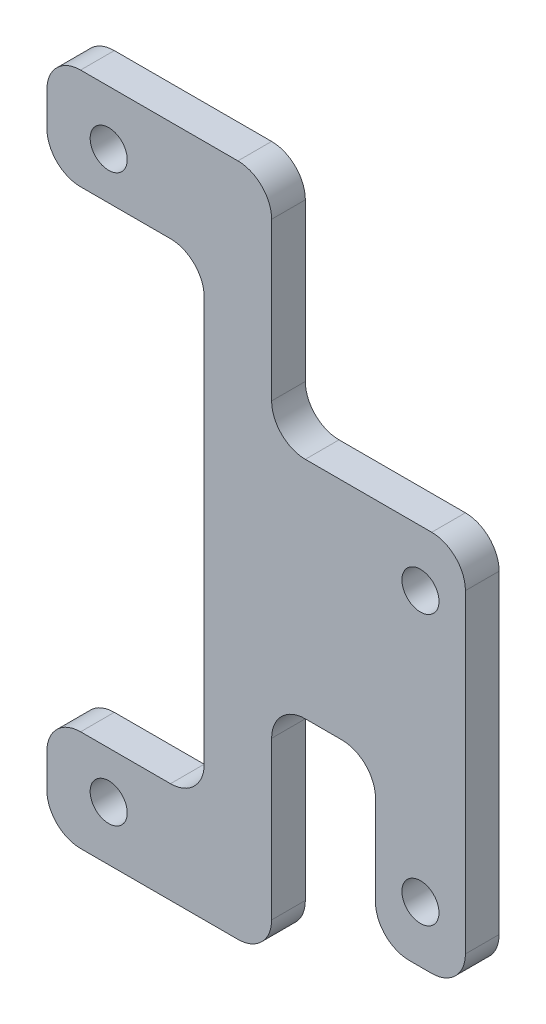
ISO-10303-21;
HEADER;
FILE_DESCRIPTION(('STEP AP214'),'2;1');
FILE_NAME('part.step','',(''),(''),'','','');
FILE_SCHEMA(('AUTOMOTIVE_DESIGN { 1 0 10303 214 1 1 1 1 }'));
ENDSEC;
DATA;
#1=APPLICATION_CONTEXT('core data for automotive mechanical design processes');
#2=APPLICATION_PROTOCOL_DEFINITION('international standard','automotive_design',2000,#1);
#3=PRODUCT_CONTEXT('',#1,'mechanical');
#4=PRODUCT('Part','Part','',(#3));
#5=PRODUCT_RELATED_PRODUCT_CATEGORY('part','',(#4));
#6=PRODUCT_DEFINITION_FORMATION('','',#4);
#7=PRODUCT_DEFINITION_CONTEXT('part definition',#1,'design');
#8=PRODUCT_DEFINITION('design','',#6,#7);
#9=PRODUCT_DEFINITION_SHAPE('','',#8);
#10=(LENGTH_UNIT() NAMED_UNIT(*) SI_UNIT(.MILLI.,.METRE.));
#11=(NAMED_UNIT(*) PLANE_ANGLE_UNIT() SI_UNIT($,.RADIAN.));
#12=(NAMED_UNIT(*) SI_UNIT($,.STERADIAN.) SOLID_ANGLE_UNIT());
#13=UNCERTAINTY_MEASURE_WITH_UNIT(LENGTH_MEASURE(1.E-05),#10,'distance_accuracy_value','');
#14=(GEOMETRIC_REPRESENTATION_CONTEXT(3) GLOBAL_UNCERTAINTY_ASSIGNED_CONTEXT((#13)) GLOBAL_UNIT_ASSIGNED_CONTEXT((#10,
#11,#12)) REPRESENTATION_CONTEXT('',''));
#15=CARTESIAN_POINT('',(0.,0.,0.));
#16=DIRECTION('',(0.,0.,1.));
#17=DIRECTION('',(1.,0.,0.));
#18=AXIS2_PLACEMENT_3D('',#15,#16,#17);
#19=CARTESIAN_POINT('',(-33.245,0.,0.));
#20=DIRECTION('',(-1.,0.,0.));
#21=DIRECTION('',(0.,-1.,0.));
#22=AXIS2_PLACEMENT_3D('',#19,#20,#21);
#23=PLANE('',#22);
#24=DIRECTION('',(0.,-1.,0.));
#25=VECTOR('',#24,1.);
#26=CARTESIAN_POINT('',(-33.245,37.,0.));
#27=LINE('',#26,#25);
#28=CARTESIAN_POINT('',(-33.245,34.,0.));
#29=VERTEX_POINT('',#28);
#30=CARTESIAN_POINT('',(-33.245,31.,0.));
#31=VERTEX_POINT('',#30);
#32=EDGE_CURVE('E504',#29,#31,#27,.T.);
#33=ORIENTED_EDGE('',*,*,#32,.T.);
#34=DIRECTION('',(0.,0.,-1.));
#35=VECTOR('',#34,1.);
#36=CARTESIAN_POINT('',(-33.245,31.,3.));
#37=LINE('',#36,#35);
#38=CARTESIAN_POINT('',(-33.245,31.,3.));
#39=VERTEX_POINT('',#38);
#40=EDGE_CURVE('E66',#31,#39,#37,.F.);
#41=ORIENTED_EDGE('',*,*,#40,.T.);
#42=DIRECTION('',(0.,1.,0.));
#43=VECTOR('',#42,1.);
#44=CARTESIAN_POINT('',(-33.245,37.,3.));
#45=LINE('',#44,#43);
#46=CARTESIAN_POINT('',(-33.245,34.,3.));
#47=VERTEX_POINT('',#46);
#48=EDGE_CURVE('E496',#39,#47,#45,.T.);
#49=ORIENTED_EDGE('',*,*,#48,.T.);
#50=DIRECTION('',(0.,0.,-1.));
#51=VECTOR('',#50,1.);
#52=CARTESIAN_POINT('',(-33.245,34.,0.));
#53=LINE('',#52,#51);
#54=EDGE_CURVE('E427',#47,#29,#53,.T.);
#55=ORIENTED_EDGE('',*,*,#54,.T.);
#56=EDGE_LOOP('',(#33,#41,#49,#55));
#57=FACE_BOUND('',#56,.T.);
#58=ADVANCED_FACE('F43',(#57),#23,.T.);
#59=CARTESIAN_POINT('',(-4.,17.,3.));
#60=DIRECTION('',(1.,0.,0.));
#61=DIRECTION('',(0.,1.,0.));
#62=AXIS2_PLACEMENT_3D('',#59,#60,#61);
#63=PLANE('',#62);
#64=DIRECTION('',(0.,-1.,0.));
#65=VECTOR('',#64,1.);
#66=CARTESIAN_POINT('',(-4.,17.,0.));
#67=LINE('',#66,#65);
#68=CARTESIAN_POINT('',(-4.,-6.,0.));
#69=VERTEX_POINT('',#68);
#70=CARTESIAN_POINT('',(-4.,-14.,0.));
#71=VERTEX_POINT('',#70);
#72=EDGE_CURVE('E267',#69,#71,#67,.T.);
#73=ORIENTED_EDGE('',*,*,#72,.T.);
#74=DIRECTION('',(0.,0.,-1.));
#75=VECTOR('',#74,1.);
#76=CARTESIAN_POINT('',(-4.,-14.,3.));
#77=LINE('',#76,#75);
#78=CARTESIAN_POINT('',(-4.,-14.,3.));
#79=VERTEX_POINT('',#78);
#80=EDGE_CURVE('E353',#71,#79,#77,.F.);
#81=ORIENTED_EDGE('',*,*,#80,.T.);
#82=DIRECTION('',(0.,-1.,0.));
#83=VECTOR('',#82,1.);
#84=CARTESIAN_POINT('',(-4.,17.,3.));
#85=LINE('',#84,#83);
#86=CARTESIAN_POINT('',(-4.,-6.,3.));
#87=VERTEX_POINT('',#86);
#88=EDGE_CURVE('E550',#87,#79,#85,.T.);
#89=ORIENTED_EDGE('',*,*,#88,.F.);
#90=DIRECTION('',(0.,0.,1.));
#91=VECTOR('',#90,1.);
#92=CARTESIAN_POINT('',(-4.,-6.,0.));
#93=LINE('',#92,#91);
#94=EDGE_CURVE('E350',#87,#69,#93,.F.);
#95=ORIENTED_EDGE('',*,*,#94,.T.);
#96=EDGE_LOOP('',(#73,#81,#89,#95));
#97=FACE_BOUND('',#96,.T.);
#98=ADVANCED_FACE('F566',(#97),#63,.F.);
#99=CARTESIAN_POINT('',(0.,0.,3.));
#100=DIRECTION('',(0.,0.,1.));
#101=DIRECTION('',(1.,0.,0.));
#102=AXIS2_PLACEMENT_3D('',#99,#100,#101);
#103=PLANE('',#102);
#104=CARTESIAN_POINT('',(-27.745,32.17,3.));
#105=DIRECTION('',(0.,0.,1.));
#106=DIRECTION('',(1.,0.,0.));
#107=AXIS2_PLACEMENT_3D('',#104,#105,#106);
#108=CIRCLE('',#107,1.65);
#109=CARTESIAN_POINT('',(-26.095,32.17,3.));
#110=VERTEX_POINT('',#109);
#111=EDGE_CURVE('E291',#110,#110,#108,.T.);
#112=ORIENTED_EDGE('',*,*,#111,.F.);
#113=EDGE_LOOP('',(#112));
#114=FACE_BOUND('',#113,.T.);
#115=CARTESIAN_POINT('',(-27.745,-18.17,3.));
#116=DIRECTION('',(0.,0.,1.));
#117=DIRECTION('',(-1.,0.,0.));
#118=AXIS2_PLACEMENT_3D('',#115,#116,#117);
#119=CIRCLE('',#118,1.65);
#120=CARTESIAN_POINT('',(-29.395,-18.17,3.));
#121=VERTEX_POINT('',#120);
#122=EDGE_CURVE('E621',#121,#121,#119,.T.);
#123=ORIENTED_EDGE('',*,*,#122,.F.);
#124=EDGE_LOOP('',(#123));
#125=FACE_BOUND('',#124,.T.);
#126=DIRECTION('',(1.,0.,0.));
#127=VECTOR('',#126,1.);
#128=CARTESIAN_POINT('',(-4.,-17.,3.));
#129=LINE('',#128,#127);
#130=CARTESIAN_POINT('',(-0.999999999999999,-17.,3.));
#131=VERTEX_POINT('',#130);
#132=CARTESIAN_POINT('',(1.,-17.,3.));
#133=VERTEX_POINT('',#132);
#134=EDGE_CURVE('E273',#131,#133,#129,.T.);
#135=ORIENTED_EDGE('',*,*,#134,.T.);
#136=CARTESIAN_POINT('',(1.,-14.,3.));
#137=DIRECTION('',(0.,0.,1.));
#138=DIRECTION('',(1.,0.,0.));
#139=AXIS2_PLACEMENT_3D('',#136,#137,#138);
#140=CIRCLE('',#139,3.);
#141=CARTESIAN_POINT('',(4.,-14.,3.));
#142=VERTEX_POINT('',#141);
#143=EDGE_CURVE('E347',#133,#142,#140,.T.);
#144=ORIENTED_EDGE('',*,*,#143,.T.);
#145=DIRECTION('',(0.,1.,0.));
#146=VECTOR('',#145,1.);
#147=CARTESIAN_POINT('',(4.,17.,3.));
#148=LINE('',#147,#146);
#149=CARTESIAN_POINT('',(4.,14.,3.));
#150=VERTEX_POINT('',#149);
#151=EDGE_CURVE('E251',#142,#150,#148,.T.);
#152=ORIENTED_EDGE('',*,*,#151,.T.);
#153=CARTESIAN_POINT('',(0.999999999999997,14.,3.));
#154=DIRECTION('',(0.,0.,1.));
#155=DIRECTION('',(1.,0.,0.));
#156=AXIS2_PLACEMENT_3D('',#153,#154,#155);
#157=CIRCLE('',#156,3.);
#158=CARTESIAN_POINT('',(0.999999999999997,17.,3.));
#159=VERTEX_POINT('',#158);
#160=EDGE_CURVE('E332',#150,#159,#157,.T.);
#161=ORIENTED_EDGE('',*,*,#160,.T.);
#162=DIRECTION('',(-1.,0.,0.));
#163=VECTOR('',#162,1.);
#164=CARTESIAN_POINT('',(-4.,17.,3.));
#165=LINE('',#164,#163);
#166=CARTESIAN_POINT('',(-10.245,17.,3.));
#167=VERTEX_POINT('',#166);
#168=EDGE_CURVE('E547',#159,#167,#165,.T.);
#169=ORIENTED_EDGE('',*,*,#168,.T.);
#170=CARTESIAN_POINT('',(-10.245,20.,3.));
#171=DIRECTION('',(0.,0.,1.));
#172=DIRECTION('',(1.,0.,0.));
#173=AXIS2_PLACEMENT_3D('',#170,#171,#172);
#174=CIRCLE('',#173,3.);
#175=CARTESIAN_POINT('',(-13.245,20.,3.));
#176=VERTEX_POINT('',#175);
#177=EDGE_CURVE('E454',#167,#176,#174,.F.);
#178=ORIENTED_EDGE('',*,*,#177,.T.);
#179=DIRECTION('',(0.,1.,0.));
#180=VECTOR('',#179,1.);
#181=CARTESIAN_POINT('',(-13.245,37.,3.));
#182=LINE('',#181,#180);
#183=CARTESIAN_POINT('',(-13.245,34.,3.));
#184=VERTEX_POINT('',#183);
#185=EDGE_CURVE('E484',#176,#184,#182,.T.);
#186=ORIENTED_EDGE('',*,*,#185,.T.);
#187=CARTESIAN_POINT('',(-16.245,34.,3.));
#188=DIRECTION('',(0.,0.,1.));
#189=DIRECTION('',(1.,0.,0.));
#190=AXIS2_PLACEMENT_3D('',#187,#188,#189);
#191=CIRCLE('',#190,3.);
#192=CARTESIAN_POINT('',(-16.245,37.,3.));
#193=VERTEX_POINT('',#192);
#194=EDGE_CURVE('E329',#184,#193,#191,.T.);
#195=ORIENTED_EDGE('',*,*,#194,.T.);
#196=DIRECTION('',(1.,0.,0.));
#197=VECTOR('',#196,1.);
#198=CARTESIAN_POINT('',(-33.245,37.,3.));
#199=LINE('',#198,#197);
#200=CARTESIAN_POINT('',(-30.245,37.,3.));
#201=VERTEX_POINT('',#200);
#202=EDGE_CURVE('E522',#201,#193,#199,.T.);
#203=ORIENTED_EDGE('',*,*,#202,.F.);
#204=CARTESIAN_POINT('',(-30.245,34.,3.));
#205=DIRECTION('',(0.,0.,1.));
#206=DIRECTION('',(1.,0.,0.));
#207=AXIS2_PLACEMENT_3D('',#204,#205,#206);
#208=CIRCLE('',#207,3.);
#209=EDGE_CURVE('E59',#201,#47,#208,.T.);
#210=ORIENTED_EDGE('',*,*,#209,.T.);
#211=ORIENTED_EDGE('',*,*,#48,.F.);
#212=CARTESIAN_POINT('',(-30.245,31.,3.));
#213=DIRECTION('',(0.,0.,1.));
#214=DIRECTION('',(1.,0.,0.));
#215=AXIS2_PLACEMENT_3D('',#212,#213,#214);
#216=CIRCLE('',#215,3.);
#217=CARTESIAN_POINT('',(-30.245,28.,3.));
#218=VERTEX_POINT('',#217);
#219=EDGE_CURVE('E326',#39,#218,#216,.T.);
#220=ORIENTED_EDGE('',*,*,#219,.T.);
#221=DIRECTION('',(-1.,0.,0.));
#222=VECTOR('',#221,1.);
#223=CARTESIAN_POINT('',(-33.245,28.,3.));
#224=LINE('',#223,#222);
#225=CARTESIAN_POINT('',(-22.245,28.,3.));
#226=VERTEX_POINT('',#225);
#227=EDGE_CURVE('E465',#226,#218,#224,.T.);
#228=ORIENTED_EDGE('',*,*,#227,.F.);
#229=CARTESIAN_POINT('',(-22.245,25.,3.));
#230=DIRECTION('',(0.,0.,1.));
#231=DIRECTION('',(1.,0.,0.));
#232=AXIS2_PLACEMENT_3D('',#229,#230,#231);
#233=CIRCLE('',#232,3.);
#234=CARTESIAN_POINT('',(-19.245,25.,3.));
#235=VERTEX_POINT('',#234);
#236=EDGE_CURVE('E52',#226,#235,#233,.F.);
#237=ORIENTED_EDGE('',*,*,#236,.T.);
#238=DIRECTION('',(0.,1.,0.));
#239=VECTOR('',#238,1.);
#240=CARTESIAN_POINT('',(-19.245,28.,3.));
#241=LINE('',#240,#239);
#242=CARTESIAN_POINT('',(-19.245,-11.,3.));
#243=VERTEX_POINT('',#242);
#244=EDGE_CURVE('E463',#243,#235,#241,.T.);
#245=ORIENTED_EDGE('',*,*,#244,.F.);
#246=CARTESIAN_POINT('',(-22.245,-11.,3.));
#247=DIRECTION('',(0.,0.,1.));
#248=DIRECTION('',(1.,0.,0.));
#249=AXIS2_PLACEMENT_3D('',#246,#247,#248);
#250=CIRCLE('',#249,3.);
#251=CARTESIAN_POINT('',(-22.245,-14.,3.));
#252=VERTEX_POINT('',#251);
#253=EDGE_CURVE('E445',#243,#252,#250,.F.);
#254=ORIENTED_EDGE('',*,*,#253,.T.);
#255=DIRECTION('',(1.,0.,0.));
#256=VECTOR('',#255,1.);
#257=CARTESIAN_POINT('',(-33.245,-14.,3.));
#258=LINE('',#257,#256);
#259=CARTESIAN_POINT('',(-30.245,-14.,3.));
#260=VERTEX_POINT('',#259);
#261=EDGE_CURVE('E295',#260,#252,#258,.T.);
#262=ORIENTED_EDGE('',*,*,#261,.F.);
#263=CARTESIAN_POINT('',(-30.245,-17.,3.));
#264=DIRECTION('',(0.,0.,1.));
#265=DIRECTION('',(1.,0.,0.));
#266=AXIS2_PLACEMENT_3D('',#263,#264,#265);
#267=CIRCLE('',#266,3.);
#268=CARTESIAN_POINT('',(-33.245,-17.,3.));
#269=VERTEX_POINT('',#268);
#270=EDGE_CURVE('E335',#260,#269,#267,.T.);
#271=ORIENTED_EDGE('',*,*,#270,.T.);
#272=CARTESIAN_POINT('',(-33.245,-20.,3.));
#273=VERTEX_POINT('',#272);
#274=EDGE_CURVE('E499',#273,#269,#45,.T.);
#275=ORIENTED_EDGE('',*,*,#274,.F.);
#276=CARTESIAN_POINT('',(-30.245,-20.,3.));
#277=DIRECTION('',(0.,0.,1.));
#278=DIRECTION('',(1.,0.,0.));
#279=AXIS2_PLACEMENT_3D('',#276,#277,#278);
#280=CIRCLE('',#279,3.);
#281=CARTESIAN_POINT('',(-30.245,-23.,3.));
#282=VERTEX_POINT('',#281);
#283=EDGE_CURVE('E338',#273,#282,#280,.T.);
#284=ORIENTED_EDGE('',*,*,#283,.T.);
#285=DIRECTION('',(1.,0.,0.));
#286=VECTOR('',#285,1.);
#287=CARTESIAN_POINT('',(-33.245,-23.,3.));
#288=LINE('',#287,#286);
#289=CARTESIAN_POINT('',(-16.245,-23.,3.));
#290=VERTEX_POINT('',#289);
#291=EDGE_CURVE('E510',#282,#290,#288,.T.);
#292=ORIENTED_EDGE('',*,*,#291,.T.);
#293=CARTESIAN_POINT('',(-16.245,-20.,3.));
#294=DIRECTION('',(0.,0.,1.));
#295=DIRECTION('',(1.,0.,0.));
#296=AXIS2_PLACEMENT_3D('',#293,#294,#295);
#297=CIRCLE('',#296,3.);
#298=CARTESIAN_POINT('',(-13.245,-20.,3.));
#299=VERTEX_POINT('',#298);
#300=EDGE_CURVE('E341',#290,#299,#297,.T.);
#301=ORIENTED_EDGE('',*,*,#300,.T.);
#302=CARTESIAN_POINT('',(-13.245,-6.,3.));
#303=VERTEX_POINT('',#302);
#304=EDGE_CURVE('E490',#299,#303,#182,.T.);
#305=ORIENTED_EDGE('',*,*,#304,.T.);
#306=CARTESIAN_POINT('',(-10.245,-6.,3.));
#307=DIRECTION('',(0.,0.,1.));
#308=DIRECTION('',(1.,0.,0.));
#309=AXIS2_PLACEMENT_3D('',#306,#307,#308);
#310=CIRCLE('',#309,3.);
#311=CARTESIAN_POINT('',(-10.245,-3.,3.));
#312=VERTEX_POINT('',#311);
#313=EDGE_CURVE('E439',#303,#312,#310,.F.);
#314=ORIENTED_EDGE('',*,*,#313,.T.);
#315=DIRECTION('',(1.,0.,0.));
#316=VECTOR('',#315,1.);
#317=CARTESIAN_POINT('',(-13.245,-3.,3.));
#318=LINE('',#317,#316);
#319=CARTESIAN_POINT('',(-7.,-3.,3.));
#320=VERTEX_POINT('',#319);
#321=EDGE_CURVE('E526',#312,#320,#318,.T.);
#322=ORIENTED_EDGE('',*,*,#321,.T.);
#323=CARTESIAN_POINT('',(-7.,-6.,3.));
#324=DIRECTION('',(0.,0.,1.));
#325=DIRECTION('',(1.,0.,0.));
#326=AXIS2_PLACEMENT_3D('',#323,#324,#325);
#327=CIRCLE('',#326,3.);
#328=EDGE_CURVE('E433',#320,#87,#327,.F.);
#329=ORIENTED_EDGE('',*,*,#328,.T.);
#330=ORIENTED_EDGE('',*,*,#88,.T.);
#331=CARTESIAN_POINT('',(-0.999999999999999,-14.,3.));
#332=DIRECTION('',(0.,0.,1.));
#333=DIRECTION('',(1.,0.,0.));
#334=AXIS2_PLACEMENT_3D('',#331,#332,#333);
#335=CIRCLE('',#334,3.);
#336=EDGE_CURVE('E344',#79,#131,#335,.T.);
#337=ORIENTED_EDGE('',*,*,#336,.T.);
#338=EDGE_LOOP('',(#135,#144,#152,#161,#169,#178,#186,#195,#203,#210,#211,#220,#228,#237,#245,
#254,#262,#271,#275,#284,#292,#301,#305,#314,#322,#329,#330,#337));
#339=FACE_BOUND('',#338,.T.);
#340=CARTESIAN_POINT('',(0.,12.,3.));
#341=DIRECTION('',(0.,0.,1.));
#342=DIRECTION('',(1.,0.,0.));
#343=AXIS2_PLACEMENT_3D('',#340,#341,#342);
#344=CIRCLE('',#343,1.65);
#345=CARTESIAN_POINT('',(1.65,12.,3.));
#346=VERTEX_POINT('',#345);
#347=EDGE_CURVE('E262',#346,#346,#344,.T.);
#348=ORIENTED_EDGE('',*,*,#347,.F.);
#349=EDGE_LOOP('',(#348));
#350=FACE_BOUND('',#349,.T.);
#351=CARTESIAN_POINT('',(0.,-12.,3.));
#352=DIRECTION('',(0.,0.,1.));
#353=DIRECTION('',(-1.,0.,0.));
#354=AXIS2_PLACEMENT_3D('',#351,#352,#353);
#355=CIRCLE('',#354,1.65);
#356=CARTESIAN_POINT('',(-1.65,-12.,3.));
#357=VERTEX_POINT('',#356);
#358=EDGE_CURVE('E535',#357,#357,#355,.T.);
#359=ORIENTED_EDGE('',*,*,#358,.F.);
#360=EDGE_LOOP('',(#359));
#361=FACE_BOUND('',#360,.T.);
#362=ADVANCED_FACE('F461',(#114,#125,#339,#350,#361),#103,.T.);
#363=CARTESIAN_POINT('',(0.,0.,0.));
#364=DIRECTION('',(0.,0.,1.));
#365=DIRECTION('',(1.,0.,0.));
#366=AXIS2_PLACEMENT_3D('',#363,#364,#365);
#367=PLANE('',#366);
#368=CARTESIAN_POINT('',(-27.745,32.17,0.));
#369=DIRECTION('',(0.,0.,1.));
#370=DIRECTION('',(1.,0.,0.));
#371=AXIS2_PLACEMENT_3D('',#368,#369,#370);
#372=CIRCLE('',#371,1.65);
#373=CARTESIAN_POINT('',(-26.095,32.17,0.));
#374=VERTEX_POINT('',#373);
#375=EDGE_CURVE('E290',#374,#374,#372,.T.);
#376=ORIENTED_EDGE('',*,*,#375,.T.);
#377=EDGE_LOOP('',(#376));
#378=FACE_BOUND('',#377,.T.);
#379=CARTESIAN_POINT('',(-27.745,-18.17,0.));
#380=DIRECTION('',(0.,0.,1.));
#381=DIRECTION('',(1.,0.,0.));
#382=AXIS2_PLACEMENT_3D('',#379,#380,#381);
#383=CIRCLE('',#382,1.65);
#384=CARTESIAN_POINT('',(-26.095,-18.17,0.));
#385=VERTEX_POINT('',#384);
#386=EDGE_CURVE('E286',#385,#385,#383,.T.);
#387=ORIENTED_EDGE('',*,*,#386,.T.);
#388=EDGE_LOOP('',(#387));
#389=FACE_BOUND('',#388,.T.);
#390=DIRECTION('',(0.,1.,0.));
#391=VECTOR('',#390,1.);
#392=CARTESIAN_POINT('',(4.,17.,0.));
#393=LINE('',#392,#391);
#394=CARTESIAN_POINT('',(4.,-14.,0.));
#395=VERTEX_POINT('',#394);
#396=CARTESIAN_POINT('',(4.,14.,0.));
#397=VERTEX_POINT('',#396);
#398=EDGE_CURVE('E248',#395,#397,#393,.T.);
#399=ORIENTED_EDGE('',*,*,#398,.F.);
#400=CARTESIAN_POINT('',(1.,-14.,0.));
#401=DIRECTION('',(0.,0.,1.));
#402=DIRECTION('',(1.,0.,0.));
#403=AXIS2_PLACEMENT_3D('',#400,#401,#402);
#404=CIRCLE('',#403,3.);
#405=CARTESIAN_POINT('',(1.,-17.,0.));
#406=VERTEX_POINT('',#405);
#407=EDGE_CURVE('E230',#395,#406,#404,.F.);
#408=ORIENTED_EDGE('',*,*,#407,.T.);
#409=DIRECTION('',(1.,0.,0.));
#410=VECTOR('',#409,1.);
#411=CARTESIAN_POINT('',(-4.,-17.,0.));
#412=LINE('',#411,#410);
#413=CARTESIAN_POINT('',(-0.999999999999999,-17.,0.));
#414=VERTEX_POINT('',#413);
#415=EDGE_CURVE('E279',#414,#406,#412,.T.);
#416=ORIENTED_EDGE('',*,*,#415,.F.);
#417=CARTESIAN_POINT('',(-0.999999999999999,-14.,0.));
#418=DIRECTION('',(0.,0.,1.));
#419=DIRECTION('',(1.,0.,0.));
#420=AXIS2_PLACEMENT_3D('',#417,#418,#419);
#421=CIRCLE('',#420,3.);
#422=EDGE_CURVE('E242',#414,#71,#421,.F.);
#423=ORIENTED_EDGE('',*,*,#422,.T.);
#424=ORIENTED_EDGE('',*,*,#72,.F.);
#425=CARTESIAN_POINT('',(-7.,-6.,0.));
#426=DIRECTION('',(0.,0.,1.));
#427=DIRECTION('',(1.,0.,0.));
#428=AXIS2_PLACEMENT_3D('',#425,#426,#427);
#429=CIRCLE('',#428,3.);
#430=CARTESIAN_POINT('',(-7.,-3.,0.));
#431=VERTEX_POINT('',#430);
#432=EDGE_CURVE('E436',#69,#431,#429,.T.);
#433=ORIENTED_EDGE('',*,*,#432,.T.);
#434=DIRECTION('',(1.,0.,0.));
#435=VECTOR('',#434,1.);
#436=CARTESIAN_POINT('',(-13.245,-3.,0.));
#437=LINE('',#436,#435);
#438=CARTESIAN_POINT('',(-10.245,-3.,0.));
#439=VERTEX_POINT('',#438);
#440=EDGE_CURVE('E530',#439,#431,#437,.T.);
#441=ORIENTED_EDGE('',*,*,#440,.F.);
#442=CARTESIAN_POINT('',(-10.245,-6.,0.));
#443=DIRECTION('',(0.,0.,1.));
#444=DIRECTION('',(1.,0.,0.));
#445=AXIS2_PLACEMENT_3D('',#442,#443,#444);
#446=CIRCLE('',#445,3.);
#447=CARTESIAN_POINT('',(-13.245,-6.,0.));
#448=VERTEX_POINT('',#447);
#449=EDGE_CURVE('E442',#439,#448,#446,.T.);
#450=ORIENTED_EDGE('',*,*,#449,.T.);
#451=DIRECTION('',(0.,-1.,0.));
#452=VECTOR('',#451,1.);
#453=CARTESIAN_POINT('',(-13.245,37.,0.));
#454=LINE('',#453,#452);
#455=CARTESIAN_POINT('',(-13.245,-20.,0.));
#456=VERTEX_POINT('',#455);
#457=EDGE_CURVE('E506',#448,#456,#454,.T.);
#458=ORIENTED_EDGE('',*,*,#457,.T.);
#459=CARTESIAN_POINT('',(-16.245,-20.,0.));
#460=DIRECTION('',(0.,0.,1.));
#461=DIRECTION('',(1.,0.,0.));
#462=AXIS2_PLACEMENT_3D('',#459,#460,#461);
#463=CIRCLE('',#462,3.);
#464=CARTESIAN_POINT('',(-16.245,-23.,0.));
#465=VERTEX_POINT('',#464);
#466=EDGE_CURVE('E314',#456,#465,#463,.F.);
#467=ORIENTED_EDGE('',*,*,#466,.T.);
#468=DIRECTION('',(1.,0.,0.));
#469=VECTOR('',#468,1.);
#470=CARTESIAN_POINT('',(-33.245,-23.,0.));
#471=LINE('',#470,#469);
#472=CARTESIAN_POINT('',(-30.245,-23.,0.));
#473=VERTEX_POINT('',#472);
#474=EDGE_CURVE('E514',#473,#465,#471,.T.);
#475=ORIENTED_EDGE('',*,*,#474,.F.);
#476=CARTESIAN_POINT('',(-30.245,-20.,0.));
#477=DIRECTION('',(0.,0.,1.));
#478=DIRECTION('',(1.,0.,0.));
#479=AXIS2_PLACEMENT_3D('',#476,#477,#478);
#480=CIRCLE('',#479,3.);
#481=CARTESIAN_POINT('',(-33.245,-20.,0.));
#482=VERTEX_POINT('',#481);
#483=EDGE_CURVE('E311',#473,#482,#480,.F.);
#484=ORIENTED_EDGE('',*,*,#483,.T.);
#485=CARTESIAN_POINT('',(-33.245,-17.,0.));
#486=VERTEX_POINT('',#485);
#487=EDGE_CURVE('E501',#486,#482,#27,.T.);
#488=ORIENTED_EDGE('',*,*,#487,.F.);
#489=CARTESIAN_POINT('',(-30.245,-17.,0.));
#490=DIRECTION('',(0.,0.,1.));
#491=DIRECTION('',(1.,0.,0.));
#492=AXIS2_PLACEMENT_3D('',#489,#490,#491);
#493=CIRCLE('',#492,3.);
#494=CARTESIAN_POINT('',(-30.245,-14.,0.));
#495=VERTEX_POINT('',#494);
#496=EDGE_CURVE('E308',#486,#495,#493,.F.);
#497=ORIENTED_EDGE('',*,*,#496,.T.);
#498=DIRECTION('',(1.,0.,0.));
#499=VECTOR('',#498,1.);
#500=CARTESIAN_POINT('',(0.,-14.,0.));
#501=LINE('',#500,#499);
#502=CARTESIAN_POINT('',(-22.245,-14.,0.));
#503=VERTEX_POINT('',#502);
#504=EDGE_CURVE('E485',#495,#503,#501,.T.);
#505=ORIENTED_EDGE('',*,*,#504,.T.);
#506=CARTESIAN_POINT('',(-22.245,-11.,0.));
#507=DIRECTION('',(0.,0.,1.));
#508=DIRECTION('',(1.,0.,0.));
#509=AXIS2_PLACEMENT_3D('',#506,#507,#508);
#510=CIRCLE('',#509,3.);
#511=CARTESIAN_POINT('',(-19.245,-11.,0.));
#512=VERTEX_POINT('',#511);
#513=EDGE_CURVE('E448',#503,#512,#510,.T.);
#514=ORIENTED_EDGE('',*,*,#513,.T.);
#515=DIRECTION('',(0.,1.,0.));
#516=VECTOR('',#515,1.);
#517=CARTESIAN_POINT('',(-19.245,0.,0.));
#518=LINE('',#517,#516);
#519=CARTESIAN_POINT('',(-19.245,25.,0.));
#520=VERTEX_POINT('',#519);
#521=EDGE_CURVE('E282',#512,#520,#518,.T.);
#522=ORIENTED_EDGE('',*,*,#521,.T.);
#523=CARTESIAN_POINT('',(-22.245,25.,0.));
#524=DIRECTION('',(0.,0.,1.));
#525=DIRECTION('',(1.,0.,0.));
#526=AXIS2_PLACEMENT_3D('',#523,#524,#525);
#527=CIRCLE('',#526,3.);
#528=CARTESIAN_POINT('',(-22.245,28.,0.));
#529=VERTEX_POINT('',#528);
#530=EDGE_CURVE('E11',#520,#529,#527,.T.);
#531=ORIENTED_EDGE('',*,*,#530,.T.);
#532=DIRECTION('',(-1.,0.,0.));
#533=VECTOR('',#532,1.);
#534=CARTESIAN_POINT('',(0.,28.,0.));
#535=LINE('',#534,#533);
#536=CARTESIAN_POINT('',(-30.245,28.,0.));
#537=VERTEX_POINT('',#536);
#538=EDGE_CURVE('E479',#529,#537,#535,.T.);
#539=ORIENTED_EDGE('',*,*,#538,.T.);
#540=CARTESIAN_POINT('',(-30.245,31.,0.));
#541=DIRECTION('',(0.,0.,1.));
#542=DIRECTION('',(1.,0.,0.));
#543=AXIS2_PLACEMENT_3D('',#540,#541,#542);
#544=CIRCLE('',#543,3.);
#545=EDGE_CURVE('E300',#537,#31,#544,.F.);
#546=ORIENTED_EDGE('',*,*,#545,.T.);
#547=ORIENTED_EDGE('',*,*,#32,.F.);
#548=CARTESIAN_POINT('',(-30.245,34.,0.));
#549=DIRECTION('',(0.,0.,1.));
#550=DIRECTION('',(1.,0.,0.));
#551=AXIS2_PLACEMENT_3D('',#548,#549,#550);
#552=CIRCLE('',#551,3.);
#553=CARTESIAN_POINT('',(-30.245,37.,0.));
#554=VERTEX_POINT('',#553);
#555=EDGE_CURVE('E253',#29,#554,#552,.F.);
#556=ORIENTED_EDGE('',*,*,#555,.T.);
#557=DIRECTION('',(1.,0.,0.));
#558=VECTOR('',#557,1.);
#559=CARTESIAN_POINT('',(-33.245,37.,0.));
#560=LINE('',#559,#558);
#561=CARTESIAN_POINT('',(-16.245,37.,0.));
#562=VERTEX_POINT('',#561);
#563=EDGE_CURVE('E518',#554,#562,#560,.T.);
#564=ORIENTED_EDGE('',*,*,#563,.T.);
#565=CARTESIAN_POINT('',(-16.245,34.,0.));
#566=DIRECTION('',(0.,0.,1.));
#567=DIRECTION('',(1.,0.,0.));
#568=AXIS2_PLACEMENT_3D('',#565,#566,#567);
#569=CIRCLE('',#568,3.);
#570=CARTESIAN_POINT('',(-13.245,34.,0.));
#571=VERTEX_POINT('',#570);
#572=EDGE_CURVE('E303',#562,#571,#569,.F.);
#573=ORIENTED_EDGE('',*,*,#572,.T.);
#574=CARTESIAN_POINT('',(-13.245,20.,0.));
#575=VERTEX_POINT('',#574);
#576=EDGE_CURVE('E500',#571,#575,#454,.T.);
#577=ORIENTED_EDGE('',*,*,#576,.T.);
#578=CARTESIAN_POINT('',(-10.245,20.,0.));
#579=DIRECTION('',(0.,0.,1.));
#580=DIRECTION('',(1.,0.,0.));
#581=AXIS2_PLACEMENT_3D('',#578,#579,#580);
#582=CIRCLE('',#581,3.);
#583=CARTESIAN_POINT('',(-10.245,17.,0.));
#584=VERTEX_POINT('',#583);
#585=EDGE_CURVE('E451',#575,#584,#582,.T.);
#586=ORIENTED_EDGE('',*,*,#585,.T.);
#587=DIRECTION('',(-1.,0.,0.));
#588=VECTOR('',#587,1.);
#589=CARTESIAN_POINT('',(-4.,17.,0.));
#590=LINE('',#589,#588);
#591=CARTESIAN_POINT('',(0.999999999999997,17.,0.));
#592=VERTEX_POINT('',#591);
#593=EDGE_CURVE('E261',#592,#584,#590,.T.);
#594=ORIENTED_EDGE('',*,*,#593,.F.);
#595=CARTESIAN_POINT('',(0.999999999999997,14.,0.));
#596=DIRECTION('',(0.,0.,1.));
#597=DIRECTION('',(1.,0.,0.));
#598=AXIS2_PLACEMENT_3D('',#595,#596,#597);
#599=CIRCLE('',#598,3.);
#600=EDGE_CURVE('E259',#592,#397,#599,.F.);
#601=ORIENTED_EDGE('',*,*,#600,.T.);
#602=EDGE_LOOP('',(#399,#408,#416,#423,#424,#433,#441,#450,#458,#467,#475,#484,#488,#497,#505,
#514,#522,#531,#539,#546,#547,#556,#564,#573,#577,#586,#594,#601));
#603=FACE_BOUND('',#602,.T.);
#604=CARTESIAN_POINT('',(0.,12.,0.));
#605=DIRECTION('',(0.,0.,1.));
#606=DIRECTION('',(1.,0.,0.));
#607=AXIS2_PLACEMENT_3D('',#604,#605,#606);
#608=CIRCLE('',#607,1.65);
#609=CARTESIAN_POINT('',(1.65,12.,0.));
#610=VERTEX_POINT('',#609);
#611=EDGE_CURVE('E270',#610,#610,#608,.T.);
#612=ORIENTED_EDGE('',*,*,#611,.T.);
#613=EDGE_LOOP('',(#612));
#614=FACE_BOUND('',#613,.T.);
#615=CARTESIAN_POINT('',(0.,-12.,0.));
#616=DIRECTION('',(0.,0.,1.));
#617=DIRECTION('',(-1.,0.,0.));
#618=AXIS2_PLACEMENT_3D('',#615,#616,#617);
#619=CIRCLE('',#618,1.65);
#620=CARTESIAN_POINT('',(-1.65,-12.,0.));
#621=VERTEX_POINT('',#620);
#622=EDGE_CURVE('E534',#621,#621,#619,.T.);
#623=ORIENTED_EDGE('',*,*,#622,.T.);
#624=EDGE_LOOP('',(#623));
#625=FACE_BOUND('',#624,.T.);
#626=ADVANCED_FACE('F256',(#378,#389,#603,#614,#625),#367,.F.);
#627=CARTESIAN_POINT('',(4.,17.,3.));
#628=DIRECTION('',(-1.,0.,0.));
#629=DIRECTION('',(0.,-1.,0.));
#630=AXIS2_PLACEMENT_3D('',#627,#628,#629);
#631=PLANE('',#630);
#632=ORIENTED_EDGE('',*,*,#151,.F.);
#633=DIRECTION('',(0.,0.,-1.));
#634=VECTOR('',#633,1.);
#635=CARTESIAN_POINT('',(4.,-14.,3.));
#636=LINE('',#635,#634);
#637=EDGE_CURVE('E234',#142,#395,#636,.T.);
#638=ORIENTED_EDGE('',*,*,#637,.T.);
#639=ORIENTED_EDGE('',*,*,#398,.T.);
#640=DIRECTION('',(0.,0.,-1.));
#641=VECTOR('',#640,1.);
#642=CARTESIAN_POINT('',(4.,14.,3.));
#643=LINE('',#642,#641);
#644=EDGE_CURVE('E254',#397,#150,#643,.F.);
#645=ORIENTED_EDGE('',*,*,#644,.T.);
#646=EDGE_LOOP('',(#632,#638,#639,#645));
#647=FACE_BOUND('',#646,.T.);
#648=ADVANCED_FACE('F247',(#647),#631,.F.);
#649=CARTESIAN_POINT('',(-4.,17.,3.));
#650=DIRECTION('',(0.,-1.,0.));
#651=DIRECTION('',(0.,0.,-1.));
#652=AXIS2_PLACEMENT_3D('',#649,#650,#651);
#653=PLANE('',#652);
#654=ORIENTED_EDGE('',*,*,#168,.F.);
#655=DIRECTION('',(0.,0.,-1.));
#656=VECTOR('',#655,1.);
#657=CARTESIAN_POINT('',(0.999999999999997,17.,3.));
#658=LINE('',#657,#656);
#659=EDGE_CURVE('E401',#159,#592,#658,.T.);
#660=ORIENTED_EDGE('',*,*,#659,.T.);
#661=ORIENTED_EDGE('',*,*,#593,.T.);
#662=DIRECTION('',(0.,0.,-1.));
#663=VECTOR('',#662,1.);
#664=CARTESIAN_POINT('',(-10.245,17.,3.));
#665=LINE('',#664,#663);
#666=EDGE_CURVE('E398',#584,#167,#665,.F.);
#667=ORIENTED_EDGE('',*,*,#666,.T.);
#668=EDGE_LOOP('',(#654,#660,#661,#667));
#669=FACE_BOUND('',#668,.T.);
#670=ADVANCED_FACE('F690',(#669),#653,.F.);
#671=CARTESIAN_POINT('',(-4.,-17.,3.));
#672=DIRECTION('',(0.,1.,0.));
#673=DIRECTION('',(0.,0.,1.));
#674=AXIS2_PLACEMENT_3D('',#671,#672,#673);
#675=PLANE('',#674);
#676=ORIENTED_EDGE('',*,*,#415,.T.);
#677=DIRECTION('',(0.,0.,-1.));
#678=VECTOR('',#677,1.);
#679=CARTESIAN_POINT('',(1.,-17.,3.));
#680=LINE('',#679,#678);
#681=EDGE_CURVE('E235',#406,#133,#680,.F.);
#682=ORIENTED_EDGE('',*,*,#681,.T.);
#683=ORIENTED_EDGE('',*,*,#134,.F.);
#684=DIRECTION('',(0.,0.,-1.));
#685=VECTOR('',#684,1.);
#686=CARTESIAN_POINT('',(-0.999999999999999,-17.,3.));
#687=LINE('',#686,#685);
#688=EDGE_CURVE('E241',#131,#414,#687,.T.);
#689=ORIENTED_EDGE('',*,*,#688,.T.);
#690=EDGE_LOOP('',(#676,#682,#683,#689));
#691=FACE_BOUND('',#690,.T.);
#692=ADVANCED_FACE('F559',(#691),#675,.F.);
#693=CARTESIAN_POINT('',(0.,12.,3.));
#694=DIRECTION('',(0.,0.,-1.));
#695=DIRECTION('',(-1.,0.,0.));
#696=AXIS2_PLACEMENT_3D('',#693,#694,#695);
#697=CYLINDRICAL_SURFACE('',#696,1.65);
#698=ORIENTED_EDGE('',*,*,#347,.T.);
#699=EDGE_LOOP('',(#698));
#700=FACE_BOUND('',#699,.T.);
#701=ORIENTED_EDGE('',*,*,#611,.F.);
#702=EDGE_LOOP('',(#701));
#703=FACE_BOUND('',#702,.T.);
#704=ADVANCED_FACE('F678',(#700,#703),#697,.F.);
#705=CARTESIAN_POINT('',(0.,-12.,3.));
#706=DIRECTION('',(0.,0.,-1.));
#707=DIRECTION('',(-1.,0.,0.));
#708=AXIS2_PLACEMENT_3D('',#705,#706,#707);
#709=CYLINDRICAL_SURFACE('',#708,1.65);
#710=ORIENTED_EDGE('',*,*,#358,.T.);
#711=EDGE_LOOP('',(#710));
#712=FACE_BOUND('',#711,.T.);
#713=ORIENTED_EDGE('',*,*,#622,.F.);
#714=EDGE_LOOP('',(#713));
#715=FACE_BOUND('',#714,.T.);
#716=ADVANCED_FACE('F675',(#712,#715),#709,.F.);
#717=CARTESIAN_POINT('',(-13.245,-3.,0.));
#718=DIRECTION('',(0.,1.,0.));
#719=DIRECTION('',(-1.,0.,0.));
#720=AXIS2_PLACEMENT_3D('',#717,#718,#719);
#721=PLANE('',#720);
#722=ORIENTED_EDGE('',*,*,#440,.T.);
#723=DIRECTION('',(0.,0.,1.));
#724=VECTOR('',#723,1.);
#725=CARTESIAN_POINT('',(-7.,-3.,3.));
#726=LINE('',#725,#724);
#727=EDGE_CURVE('E359',#431,#320,#726,.T.);
#728=ORIENTED_EDGE('',*,*,#727,.T.);
#729=ORIENTED_EDGE('',*,*,#321,.F.);
#730=DIRECTION('',(0.,0.,1.));
#731=VECTOR('',#730,1.);
#732=CARTESIAN_POINT('',(-10.245,-3.,0.));
#733=LINE('',#732,#731);
#734=EDGE_CURVE('E356',#312,#439,#733,.F.);
#735=ORIENTED_EDGE('',*,*,#734,.T.);
#736=EDGE_LOOP('',(#722,#728,#729,#735));
#737=FACE_BOUND('',#736,.T.);
#738=ADVANCED_FACE('F574',(#737),#721,.F.);
#739=CARTESIAN_POINT('',(-13.245,0.,0.));
#740=DIRECTION('',(-1.,0.,0.));
#741=DIRECTION('',(0.,-1.,0.));
#742=AXIS2_PLACEMENT_3D('',#739,#740,#741);
#743=PLANE('',#742);
#744=ORIENTED_EDGE('',*,*,#457,.F.);
#745=DIRECTION('',(0.,0.,1.));
#746=VECTOR('',#745,1.);
#747=CARTESIAN_POINT('',(-13.245,-6.,3.));
#748=LINE('',#747,#746);
#749=EDGE_CURVE('E366',#448,#303,#748,.T.);
#750=ORIENTED_EDGE('',*,*,#749,.T.);
#751=ORIENTED_EDGE('',*,*,#304,.F.);
#752=DIRECTION('',(0.,0.,1.));
#753=VECTOR('',#752,1.);
#754=CARTESIAN_POINT('',(-13.245,-20.,0.));
#755=LINE('',#754,#753);
#756=EDGE_CURVE('E363',#299,#456,#755,.F.);
#757=ORIENTED_EDGE('',*,*,#756,.T.);
#758=EDGE_LOOP('',(#744,#750,#751,#757));
#759=FACE_BOUND('',#758,.T.);
#760=ADVANCED_FACE('F583',(#759),#743,.F.);
#761=ORIENTED_EDGE('',*,*,#185,.F.);
#762=DIRECTION('',(0.,0.,-1.));
#763=VECTOR('',#762,1.);
#764=CARTESIAN_POINT('',(-13.245,20.,0.));
#765=LINE('',#764,#763);
#766=EDGE_CURVE('E408',#176,#575,#765,.T.);
#767=ORIENTED_EDGE('',*,*,#766,.T.);
#768=ORIENTED_EDGE('',*,*,#576,.F.);
#769=DIRECTION('',(0.,0.,-1.));
#770=VECTOR('',#769,1.);
#771=CARTESIAN_POINT('',(-13.245,34.,0.));
#772=LINE('',#771,#770);
#773=EDGE_CURVE('E405',#571,#184,#772,.F.);
#774=ORIENTED_EDGE('',*,*,#773,.T.);
#775=EDGE_LOOP('',(#761,#767,#768,#774));
#776=FACE_BOUND('',#775,.T.);
#777=ADVANCED_FACE('F638',(#776),#743,.F.);
#778=CARTESIAN_POINT('',(-33.245,37.,0.));
#779=DIRECTION('',(0.,-1.,0.));
#780=DIRECTION('',(1.,0.,0.));
#781=AXIS2_PLACEMENT_3D('',#778,#779,#780);
#782=PLANE('',#781);
#783=ORIENTED_EDGE('',*,*,#202,.T.);
#784=DIRECTION('',(0.,0.,-1.));
#785=VECTOR('',#784,1.);
#786=CARTESIAN_POINT('',(-16.245,37.,0.));
#787=LINE('',#786,#785);
#788=EDGE_CURVE('E415',#193,#562,#787,.T.);
#789=ORIENTED_EDGE('',*,*,#788,.T.);
#790=ORIENTED_EDGE('',*,*,#563,.F.);
#791=DIRECTION('',(0.,0.,-1.));
#792=VECTOR('',#791,1.);
#793=CARTESIAN_POINT('',(-30.245,37.,3.));
#794=LINE('',#793,#792);
#795=EDGE_CURVE('E412',#554,#201,#794,.F.);
#796=ORIENTED_EDGE('',*,*,#795,.T.);
#797=EDGE_LOOP('',(#783,#789,#790,#796));
#798=FACE_BOUND('',#797,.T.);
#799=ADVANCED_FACE('F645',(#798),#782,.F.);
#800=CARTESIAN_POINT('',(-33.245,-23.,0.));
#801=DIRECTION('',(0.,1.,0.));
#802=DIRECTION('',(-1.,0.,0.));
#803=AXIS2_PLACEMENT_3D('',#800,#801,#802);
#804=PLANE('',#803);
#805=ORIENTED_EDGE('',*,*,#474,.T.);
#806=DIRECTION('',(0.,0.,1.));
#807=VECTOR('',#806,1.);
#808=CARTESIAN_POINT('',(-16.245,-23.,0.));
#809=LINE('',#808,#807);
#810=EDGE_CURVE('E373',#465,#290,#809,.T.);
#811=ORIENTED_EDGE('',*,*,#810,.T.);
#812=ORIENTED_EDGE('',*,*,#291,.F.);
#813=DIRECTION('',(0.,0.,1.));
#814=VECTOR('',#813,1.);
#815=CARTESIAN_POINT('',(-30.245,-23.,0.));
#816=LINE('',#815,#814);
#817=EDGE_CURVE('E370',#282,#473,#816,.F.);
#818=ORIENTED_EDGE('',*,*,#817,.T.);
#819=EDGE_LOOP('',(#805,#811,#812,#818));
#820=FACE_BOUND('',#819,.T.);
#821=ADVANCED_FACE('F593',(#820),#804,.F.);
#822=ORIENTED_EDGE('',*,*,#487,.T.);
#823=DIRECTION('',(0.,0.,1.));
#824=VECTOR('',#823,1.);
#825=CARTESIAN_POINT('',(-33.245,-20.,3.));
#826=LINE('',#825,#824);
#827=EDGE_CURVE('E380',#482,#273,#826,.T.);
#828=ORIENTED_EDGE('',*,*,#827,.T.);
#829=ORIENTED_EDGE('',*,*,#274,.T.);
#830=DIRECTION('',(0.,0.,1.));
#831=VECTOR('',#830,1.);
#832=CARTESIAN_POINT('',(-33.245,-17.,0.));
#833=LINE('',#832,#831);
#834=EDGE_CURVE('E377',#269,#486,#833,.F.);
#835=ORIENTED_EDGE('',*,*,#834,.T.);
#836=EDGE_LOOP('',(#822,#828,#829,#835));
#837=FACE_BOUND('',#836,.T.);
#838=ADVANCED_FACE('F602',(#837),#23,.T.);
#839=CARTESIAN_POINT('',(-19.245,28.,-7.));
#840=DIRECTION('',(1.,0.,0.));
#841=DIRECTION('',(0.,0.,-1.));
#842=AXIS2_PLACEMENT_3D('',#839,#840,#841);
#843=PLANE('',#842);
#844=ORIENTED_EDGE('',*,*,#521,.F.);
#845=DIRECTION('',(0.,0.,1.));
#846=VECTOR('',#845,1.);
#847=CARTESIAN_POINT('',(-19.245,-11.,3.));
#848=LINE('',#847,#846);
#849=EDGE_CURVE('E394',#512,#243,#848,.T.);
#850=ORIENTED_EDGE('',*,*,#849,.T.);
#851=ORIENTED_EDGE('',*,*,#244,.T.);
#852=DIRECTION('',(0.,0.,1.));
#853=VECTOR('',#852,1.);
#854=CARTESIAN_POINT('',(-19.245,25.,0.));
#855=LINE('',#854,#853);
#856=EDGE_CURVE('E391',#235,#520,#855,.F.);
#857=ORIENTED_EDGE('',*,*,#856,.T.);
#858=EDGE_LOOP('',(#844,#850,#851,#857));
#859=FACE_BOUND('',#858,.T.);
#860=ADVANCED_FACE('F471',(#859),#843,.F.);
#861=CARTESIAN_POINT('',(-33.245,28.,-7.));
#862=DIRECTION('',(0.,1.,0.));
#863=DIRECTION('',(0.,0.,1.));
#864=AXIS2_PLACEMENT_3D('',#861,#862,#863);
#865=PLANE('',#864);
#866=ORIENTED_EDGE('',*,*,#538,.F.);
#867=DIRECTION('',(0.,0.,1.));
#868=VECTOR('',#867,1.);
#869=CARTESIAN_POINT('',(-22.245,28.,3.));
#870=LINE('',#869,#868);
#871=EDGE_CURVE('E423',#529,#226,#870,.T.);
#872=ORIENTED_EDGE('',*,*,#871,.T.);
#873=ORIENTED_EDGE('',*,*,#227,.T.);
#874=DIRECTION('',(0.,0.,-1.));
#875=VECTOR('',#874,1.);
#876=CARTESIAN_POINT('',(-30.245,28.,0.));
#877=LINE('',#876,#875);
#878=EDGE_CURVE('E419',#218,#537,#877,.T.);
#879=ORIENTED_EDGE('',*,*,#878,.T.);
#880=EDGE_LOOP('',(#866,#872,#873,#879));
#881=FACE_BOUND('',#880,.T.);
#882=ADVANCED_FACE('F481',(#881),#865,.F.);
#883=CARTESIAN_POINT('',(-33.245,-14.,-7.));
#884=DIRECTION('',(0.,-1.,0.));
#885=DIRECTION('',(0.,0.,-1.));
#886=AXIS2_PLACEMENT_3D('',#883,#884,#885);
#887=PLANE('',#886);
#888=ORIENTED_EDGE('',*,*,#504,.F.);
#889=DIRECTION('',(0.,0.,1.));
#890=VECTOR('',#889,1.);
#891=CARTESIAN_POINT('',(-30.245,-14.,3.));
#892=LINE('',#891,#890);
#893=EDGE_CURVE('E387',#495,#260,#892,.T.);
#894=ORIENTED_EDGE('',*,*,#893,.T.);
#895=ORIENTED_EDGE('',*,*,#261,.T.);
#896=DIRECTION('',(0.,0.,1.));
#897=VECTOR('',#896,1.);
#898=CARTESIAN_POINT('',(-22.245,-14.,0.));
#899=LINE('',#898,#897);
#900=EDGE_CURVE('E384',#252,#503,#899,.F.);
#901=ORIENTED_EDGE('',*,*,#900,.T.);
#902=EDGE_LOOP('',(#888,#894,#895,#901));
#903=FACE_BOUND('',#902,.T.);
#904=ADVANCED_FACE('F612',(#903),#887,.F.);
#905=CARTESIAN_POINT('',(-27.745,-18.17,-7.));
#906=DIRECTION('',(0.,0.,1.));
#907=DIRECTION('',(1.,0.,0.));
#908=AXIS2_PLACEMENT_3D('',#905,#906,#907);
#909=CYLINDRICAL_SURFACE('',#908,1.65);
#910=ORIENTED_EDGE('',*,*,#122,.T.);
#911=EDGE_LOOP('',(#910));
#912=FACE_BOUND('',#911,.T.);
#913=ORIENTED_EDGE('',*,*,#386,.F.);
#914=EDGE_LOOP('',(#913));
#915=FACE_BOUND('',#914,.T.);
#916=ADVANCED_FACE('F819',(#912,#915),#909,.F.);
#917=CARTESIAN_POINT('',(-27.745,32.17,-7.));
#918=DIRECTION('',(0.,0.,1.));
#919=DIRECTION('',(1.,0.,0.));
#920=AXIS2_PLACEMENT_3D('',#917,#918,#919);
#921=CYLINDRICAL_SURFACE('',#920,1.65);
#922=ORIENTED_EDGE('',*,*,#111,.T.);
#923=EDGE_LOOP('',(#922));
#924=FACE_BOUND('',#923,.T.);
#925=ORIENTED_EDGE('',*,*,#375,.F.);
#926=EDGE_LOOP('',(#925));
#927=FACE_BOUND('',#926,.T.);
#928=ADVANCED_FACE('F699',(#924,#927),#921,.F.);
#929=CARTESIAN_POINT('',(1.,-14.,3.));
#930=DIRECTION('',(0.,0.,-1.));
#931=DIRECTION('',(-1.,0.,0.));
#932=AXIS2_PLACEMENT_3D('',#929,#930,#931);
#933=CYLINDRICAL_SURFACE('',#932,3.);
#934=ORIENTED_EDGE('',*,*,#143,.F.);
#935=ORIENTED_EDGE('',*,*,#681,.F.);
#936=ORIENTED_EDGE('',*,*,#407,.F.);
#937=ORIENTED_EDGE('',*,*,#637,.F.);
#938=EDGE_LOOP('',(#934,#935,#936,#937));
#939=FACE_BOUND('',#938,.T.);
#940=ADVANCED_FACE('F233',(#939),#933,.T.);
#941=CARTESIAN_POINT('',(-0.999999999999999,-14.,3.));
#942=DIRECTION('',(0.,0.,-1.));
#943=DIRECTION('',(-1.,0.,0.));
#944=AXIS2_PLACEMENT_3D('',#941,#942,#943);
#945=CYLINDRICAL_SURFACE('',#944,3.);
#946=ORIENTED_EDGE('',*,*,#336,.F.);
#947=ORIENTED_EDGE('',*,*,#80,.F.);
#948=ORIENTED_EDGE('',*,*,#422,.F.);
#949=ORIENTED_EDGE('',*,*,#688,.F.);
#950=EDGE_LOOP('',(#946,#947,#948,#949));
#951=FACE_BOUND('',#950,.T.);
#952=ADVANCED_FACE('F561',(#951),#945,.T.);
#953=CARTESIAN_POINT('',(-7.,-6.,0.));
#954=DIRECTION('',(0.,0.,-1.));
#955=DIRECTION('',(-1.,0.,0.));
#956=AXIS2_PLACEMENT_3D('',#953,#954,#955);
#957=CYLINDRICAL_SURFACE('',#956,3.);
#958=ORIENTED_EDGE('',*,*,#432,.F.);
#959=ORIENTED_EDGE('',*,*,#94,.F.);
#960=ORIENTED_EDGE('',*,*,#328,.F.);
#961=ORIENTED_EDGE('',*,*,#727,.F.);
#962=EDGE_LOOP('',(#958,#959,#960,#961));
#963=FACE_BOUND('',#962,.T.);
#964=ADVANCED_FACE('F569',(#963),#957,.F.);
#965=CARTESIAN_POINT('',(-10.245,-6.,0.));
#966=DIRECTION('',(0.,0.,-1.));
#967=DIRECTION('',(-1.,0.,0.));
#968=AXIS2_PLACEMENT_3D('',#965,#966,#967);
#969=CYLINDRICAL_SURFACE('',#968,3.);
#970=ORIENTED_EDGE('',*,*,#449,.F.);
#971=ORIENTED_EDGE('',*,*,#734,.F.);
#972=ORIENTED_EDGE('',*,*,#313,.F.);
#973=ORIENTED_EDGE('',*,*,#749,.F.);
#974=EDGE_LOOP('',(#970,#971,#972,#973));
#975=FACE_BOUND('',#974,.T.);
#976=ADVANCED_FACE('F578',(#975),#969,.F.);
#977=CARTESIAN_POINT('',(-16.245,-20.,0.));
#978=DIRECTION('',(0.,0.,1.));
#979=DIRECTION('',(1.,0.,0.));
#980=AXIS2_PLACEMENT_3D('',#977,#978,#979);
#981=CYLINDRICAL_SURFACE('',#980,3.);
#982=ORIENTED_EDGE('',*,*,#466,.F.);
#983=ORIENTED_EDGE('',*,*,#756,.F.);
#984=ORIENTED_EDGE('',*,*,#300,.F.);
#985=ORIENTED_EDGE('',*,*,#810,.F.);
#986=EDGE_LOOP('',(#982,#983,#984,#985));
#987=FACE_BOUND('',#986,.T.);
#988=ADVANCED_FACE('F588',(#987),#981,.T.);
#989=CARTESIAN_POINT('',(-30.245,-20.,0.));
#990=DIRECTION('',(0.,0.,-1.));
#991=DIRECTION('',(-1.,0.,0.));
#992=AXIS2_PLACEMENT_3D('',#989,#990,#991);
#993=CYLINDRICAL_SURFACE('',#992,3.);
#994=ORIENTED_EDGE('',*,*,#483,.F.);
#995=ORIENTED_EDGE('',*,*,#817,.F.);
#996=ORIENTED_EDGE('',*,*,#283,.F.);
#997=ORIENTED_EDGE('',*,*,#827,.F.);
#998=EDGE_LOOP('',(#994,#995,#996,#997));
#999=FACE_BOUND('',#998,.T.);
#1000=ADVANCED_FACE('F597',(#999),#993,.T.);
#1001=CARTESIAN_POINT('',(-30.245,-17.,-7.));
#1002=DIRECTION('',(0.,0.,-1.));
#1003=DIRECTION('',(-1.,0.,0.));
#1004=AXIS2_PLACEMENT_3D('',#1001,#1002,#1003);
#1005=CYLINDRICAL_SURFACE('',#1004,3.);
#1006=ORIENTED_EDGE('',*,*,#496,.F.);
#1007=ORIENTED_EDGE('',*,*,#834,.F.);
#1008=ORIENTED_EDGE('',*,*,#270,.F.);
#1009=ORIENTED_EDGE('',*,*,#893,.F.);
#1010=EDGE_LOOP('',(#1006,#1007,#1008,#1009));
#1011=FACE_BOUND('',#1010,.T.);
#1012=ADVANCED_FACE('F607',(#1011),#1005,.T.);
#1013=CARTESIAN_POINT('',(-22.245,-11.,-7.));
#1014=DIRECTION('',(0.,0.,-1.));
#1015=DIRECTION('',(-1.,0.,0.));
#1016=AXIS2_PLACEMENT_3D('',#1013,#1014,#1015);
#1017=CYLINDRICAL_SURFACE('',#1016,3.);
#1018=ORIENTED_EDGE('',*,*,#513,.F.);
#1019=ORIENTED_EDGE('',*,*,#900,.F.);
#1020=ORIENTED_EDGE('',*,*,#253,.F.);
#1021=ORIENTED_EDGE('',*,*,#849,.F.);
#1022=EDGE_LOOP('',(#1018,#1019,#1020,#1021));
#1023=FACE_BOUND('',#1022,.T.);
#1024=ADVANCED_FACE('F617',(#1023),#1017,.F.);
#1025=CARTESIAN_POINT('',(0.999999999999997,14.,3.));
#1026=DIRECTION('',(0.,0.,-1.));
#1027=DIRECTION('',(-1.,0.,0.));
#1028=AXIS2_PLACEMENT_3D('',#1025,#1026,#1027);
#1029=CYLINDRICAL_SURFACE('',#1028,3.);
#1030=ORIENTED_EDGE('',*,*,#160,.F.);
#1031=ORIENTED_EDGE('',*,*,#644,.F.);
#1032=ORIENTED_EDGE('',*,*,#600,.F.);
#1033=ORIENTED_EDGE('',*,*,#659,.F.);
#1034=EDGE_LOOP('',(#1030,#1031,#1032,#1033));
#1035=FACE_BOUND('',#1034,.T.);
#1036=ADVANCED_FACE('F714',(#1035),#1029,.T.);
#1037=CARTESIAN_POINT('',(-10.245,20.,0.));
#1038=DIRECTION('',(0.,0.,1.));
#1039=DIRECTION('',(1.,0.,0.));
#1040=AXIS2_PLACEMENT_3D('',#1037,#1038,#1039);
#1041=CYLINDRICAL_SURFACE('',#1040,3.);
#1042=ORIENTED_EDGE('',*,*,#177,.F.);
#1043=ORIENTED_EDGE('',*,*,#666,.F.);
#1044=ORIENTED_EDGE('',*,*,#585,.F.);
#1045=ORIENTED_EDGE('',*,*,#766,.F.);
#1046=EDGE_LOOP('',(#1042,#1043,#1044,#1045));
#1047=FACE_BOUND('',#1046,.T.);
#1048=ADVANCED_FACE('F717',(#1047),#1041,.F.);
#1049=CARTESIAN_POINT('',(-16.245,34.,0.));
#1050=DIRECTION('',(0.,0.,-1.));
#1051=DIRECTION('',(-1.,0.,0.));
#1052=AXIS2_PLACEMENT_3D('',#1049,#1050,#1051);
#1053=CYLINDRICAL_SURFACE('',#1052,3.);
#1054=ORIENTED_EDGE('',*,*,#194,.F.);
#1055=ORIENTED_EDGE('',*,*,#773,.F.);
#1056=ORIENTED_EDGE('',*,*,#572,.F.);
#1057=ORIENTED_EDGE('',*,*,#788,.F.);
#1058=EDGE_LOOP('',(#1054,#1055,#1056,#1057));
#1059=FACE_BOUND('',#1058,.T.);
#1060=ADVANCED_FACE('F642',(#1059),#1053,.T.);
#1061=CARTESIAN_POINT('',(-22.245,25.,-7.));
#1062=DIRECTION('',(0.,0.,-1.));
#1063=DIRECTION('',(-1.,0.,0.));
#1064=AXIS2_PLACEMENT_3D('',#1061,#1062,#1063);
#1065=CYLINDRICAL_SURFACE('',#1064,3.);
#1066=ORIENTED_EDGE('',*,*,#530,.F.);
#1067=ORIENTED_EDGE('',*,*,#856,.F.);
#1068=ORIENTED_EDGE('',*,*,#236,.F.);
#1069=ORIENTED_EDGE('',*,*,#871,.F.);
#1070=EDGE_LOOP('',(#1066,#1067,#1068,#1069));
#1071=FACE_BOUND('',#1070,.T.);
#1072=ADVANCED_FACE('F476',(#1071),#1065,.F.);
#1073=CARTESIAN_POINT('',(-30.245,31.,-7.));
#1074=DIRECTION('',(0.,0.,1.));
#1075=DIRECTION('',(1.,0.,0.));
#1076=AXIS2_PLACEMENT_3D('',#1073,#1074,#1075);
#1077=CYLINDRICAL_SURFACE('',#1076,3.);
#1078=ORIENTED_EDGE('',*,*,#219,.F.);
#1079=ORIENTED_EDGE('',*,*,#40,.F.);
#1080=ORIENTED_EDGE('',*,*,#545,.F.);
#1081=ORIENTED_EDGE('',*,*,#878,.F.);
#1082=EDGE_LOOP('',(#1078,#1079,#1080,#1081));
#1083=FACE_BOUND('',#1082,.T.);
#1084=ADVANCED_FACE('F626',(#1083),#1077,.T.);
#1085=CARTESIAN_POINT('',(-30.245,34.,0.));
#1086=DIRECTION('',(0.,0.,1.));
#1087=DIRECTION('',(1.,0.,0.));
#1088=AXIS2_PLACEMENT_3D('',#1085,#1086,#1087);
#1089=CYLINDRICAL_SURFACE('',#1088,3.);
#1090=ORIENTED_EDGE('',*,*,#209,.F.);
#1091=ORIENTED_EDGE('',*,*,#795,.F.);
#1092=ORIENTED_EDGE('',*,*,#555,.F.);
#1093=ORIENTED_EDGE('',*,*,#54,.F.);
#1094=EDGE_LOOP('',(#1090,#1091,#1092,#1093));
#1095=FACE_BOUND('',#1094,.T.);
#1096=ADVANCED_FACE('F45',(#1095),#1089,.T.);
#1097=CLOSED_SHELL('',(#58,#98,#362,#626,#648,#670,#692,#704,#716,#738,#760,#777,#799,#821,#838,
#860,#882,#904,#916,#928,#940,#952,#964,#976,#988,#1000,#1012,#1024,#1036,#1048,#1060,#1072,
#1084,#1096));
#1098=MANIFOLD_SOLID_BREP('B2',#1097);
#1099=ADVANCED_BREP_SHAPE_REPRESENTATION('',(#18,#1098),#14);
#1100=SHAPE_DEFINITION_REPRESENTATION(#9,#1099);
ENDSEC;
END-ISO-10303-21;
